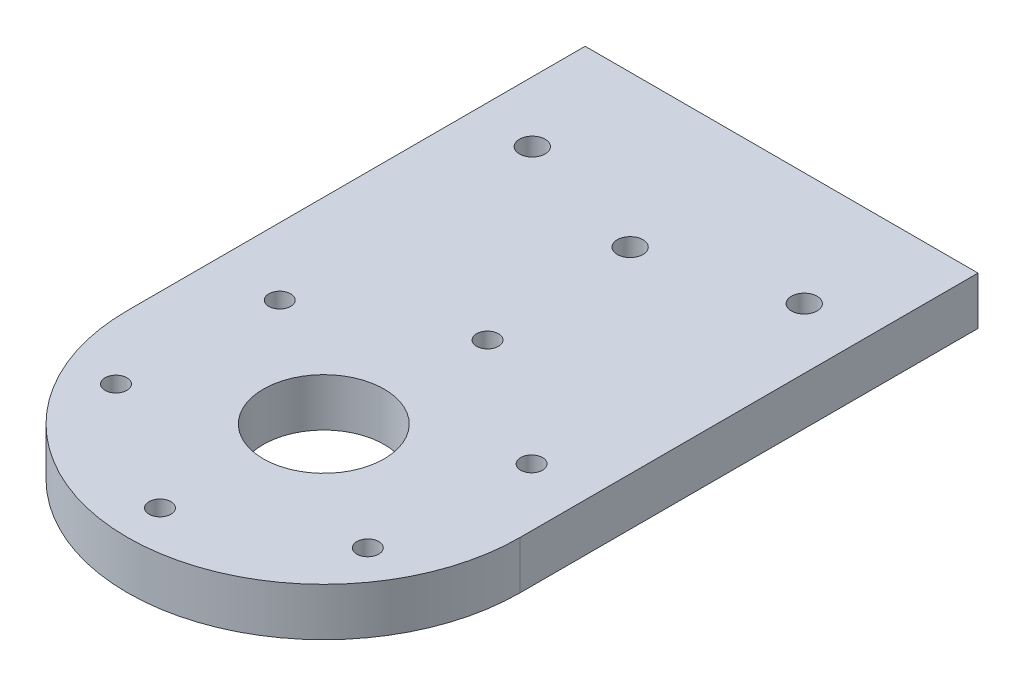
ISO-10303-21;
HEADER;
FILE_DESCRIPTION(('STEP AP214'),'2;1');
FILE_NAME('part.step','',(''),(''),'','','');
FILE_SCHEMA(('AUTOMOTIVE_DESIGN { 1 0 10303 214 1 1 1 1 }'));
ENDSEC;
DATA;
#1=APPLICATION_CONTEXT('core data for automotive mechanical design processes');
#2=APPLICATION_PROTOCOL_DEFINITION('international standard','automotive_design',2000,#1);
#3=PRODUCT_CONTEXT('',#1,'mechanical');
#4=PRODUCT('Part','Part','',(#3));
#5=PRODUCT_RELATED_PRODUCT_CATEGORY('part','',(#4));
#6=PRODUCT_DEFINITION_FORMATION('','',#4);
#7=PRODUCT_DEFINITION_CONTEXT('part definition',#1,'design');
#8=PRODUCT_DEFINITION('design','',#6,#7);
#9=PRODUCT_DEFINITION_SHAPE('','',#8);
#10=(LENGTH_UNIT() NAMED_UNIT(*) SI_UNIT(.MILLI.,.METRE.));
#11=(NAMED_UNIT(*) PLANE_ANGLE_UNIT() SI_UNIT($,.RADIAN.));
#12=(NAMED_UNIT(*) SI_UNIT($,.STERADIAN.) SOLID_ANGLE_UNIT());
#13=UNCERTAINTY_MEASURE_WITH_UNIT(LENGTH_MEASURE(1.E-05),#10,'distance_accuracy_value','');
#14=(GEOMETRIC_REPRESENTATION_CONTEXT(3) GLOBAL_UNCERTAINTY_ASSIGNED_CONTEXT((#13)) GLOBAL_UNIT_ASSIGNED_CONTEXT((#10,
#11,#12)) REPRESENTATION_CONTEXT('',''));
#15=CARTESIAN_POINT('',(0.,0.,0.));
#16=DIRECTION('',(0.,0.,1.));
#17=DIRECTION('',(1.,0.,0.));
#18=AXIS2_PLACEMENT_3D('',#15,#16,#17);
#19=CARTESIAN_POINT('',(126.4,56.875,275.95));
#20=DIRECTION('',(1.,0.,0.));
#21=DIRECTION('',(0.,0.,-1.));
#22=AXIS2_PLACEMENT_3D('',#19,#20,#21);
#23=PLANE('',#22);
#24=DIRECTION('',(0.,0.,1.));
#25=VECTOR('',#24,1.);
#26=CARTESIAN_POINT('',(126.4,50.525,275.95));
#27=LINE('',#26,#25);
#28=CARTESIAN_POINT('',(126.4,50.525,275.95));
#29=VERTEX_POINT('',#28);
#30=CARTESIAN_POINT('',(126.4,50.525,336.55));
#31=VERTEX_POINT('',#30);
#32=EDGE_CURVE('E94',#29,#31,#27,.T.);
#33=ORIENTED_EDGE('',*,*,#32,.T.);
#34=DIRECTION('',(0.,-1.,0.));
#35=VECTOR('',#34,1.);
#36=CARTESIAN_POINT('',(126.4,56.875,336.55));
#37=LINE('',#36,#35);
#38=CARTESIAN_POINT('',(126.4,56.875,336.55));
#39=VERTEX_POINT('',#38);
#40=EDGE_CURVE('E11',#39,#31,#37,.T.);
#41=ORIENTED_EDGE('',*,*,#40,.F.);
#42=DIRECTION('',(0.,0.,1.));
#43=VECTOR('',#42,1.);
#44=CARTESIAN_POINT('',(126.4,56.875,275.95));
#45=LINE('',#44,#43);
#46=CARTESIAN_POINT('',(126.4,56.875,275.95));
#47=VERTEX_POINT('',#46);
#48=EDGE_CURVE('E86',#47,#39,#45,.T.);
#49=ORIENTED_EDGE('',*,*,#48,.F.);
#50=DIRECTION('',(0.,-1.,0.));
#51=VECTOR('',#50,1.);
#52=CARTESIAN_POINT('',(126.4,56.875,275.95));
#53=LINE('',#52,#51);
#54=EDGE_CURVE('E83',#47,#29,#53,.T.);
#55=ORIENTED_EDGE('',*,*,#54,.T.);
#56=EDGE_LOOP('',(#33,#41,#49,#55));
#57=FACE_BOUND('',#56,.T.);
#58=ADVANCED_FACE('F43',(#57),#23,.F.);
#59=CARTESIAN_POINT('',(178.4,56.875,275.95));
#60=DIRECTION('',(-1.,0.,0.));
#61=DIRECTION('',(0.,0.,1.));
#62=AXIS2_PLACEMENT_3D('',#59,#60,#61);
#63=PLANE('',#62);
#64=DIRECTION('',(0.,0.,-1.));
#65=VECTOR('',#64,1.);
#66=CARTESIAN_POINT('',(178.4,50.525,275.95));
#67=LINE('',#66,#65);
#68=CARTESIAN_POINT('',(178.4,50.525,336.55));
#69=VERTEX_POINT('',#68);
#70=CARTESIAN_POINT('',(178.4,50.525,275.95));
#71=VERTEX_POINT('',#70);
#72=EDGE_CURVE('E75',#69,#71,#67,.T.);
#73=ORIENTED_EDGE('',*,*,#72,.T.);
#74=DIRECTION('',(0.,-1.,0.));
#75=VECTOR('',#74,1.);
#76=CARTESIAN_POINT('',(178.4,56.875,275.95));
#77=LINE('',#76,#75);
#78=CARTESIAN_POINT('',(178.4,56.875,275.95));
#79=VERTEX_POINT('',#78);
#80=EDGE_CURVE('E82',#79,#71,#77,.T.);
#81=ORIENTED_EDGE('',*,*,#80,.F.);
#82=DIRECTION('',(0.,0.,-1.));
#83=VECTOR('',#82,1.);
#84=CARTESIAN_POINT('',(178.4,56.875,275.95));
#85=LINE('',#84,#83);
#86=CARTESIAN_POINT('',(178.4,56.875,336.55));
#87=VERTEX_POINT('',#86);
#88=EDGE_CURVE('E108',#87,#79,#85,.T.);
#89=ORIENTED_EDGE('',*,*,#88,.F.);
#90=DIRECTION('',(0.,-1.,0.));
#91=VECTOR('',#90,1.);
#92=CARTESIAN_POINT('',(178.4,56.875,336.55));
#93=LINE('',#92,#91);
#94=EDGE_CURVE('E51',#87,#69,#93,.T.);
#95=ORIENTED_EDGE('',*,*,#94,.T.);
#96=EDGE_LOOP('',(#73,#81,#89,#95));
#97=FACE_BOUND('',#96,.T.);
#98=ADVANCED_FACE('F106',(#97),#63,.F.);
#99=CARTESIAN_POINT('',(126.4,56.875,275.95));
#100=DIRECTION('',(0.,0.,1.));
#101=DIRECTION('',(1.,0.,0.));
#102=AXIS2_PLACEMENT_3D('',#99,#100,#101);
#103=PLANE('',#102);
#104=CARTESIAN_POINT('',(130.4,53.7,275.95));
#105=DIRECTION('',(0.,0.,1.));
#106=DIRECTION('',(1.,0.,0.));
#107=AXIS2_PLACEMENT_3D('',#104,#105,#106);
#108=CIRCLE('',#107,2.);
#109=CARTESIAN_POINT('',(132.4,53.7,275.95));
#110=VERTEX_POINT('',#109);
#111=EDGE_CURVE('E169',#110,#110,#108,.T.);
#112=ORIENTED_EDGE('',*,*,#111,.T.);
#113=EDGE_LOOP('',(#112));
#114=FACE_BOUND('',#113,.T.);
#115=CARTESIAN_POINT('',(174.4,53.7,275.95));
#116=DIRECTION('',(0.,0.,1.));
#117=DIRECTION('',(1.,0.,0.));
#118=AXIS2_PLACEMENT_3D('',#115,#116,#117);
#119=CIRCLE('',#118,2.);
#120=CARTESIAN_POINT('',(176.4,53.7,275.95));
#121=VERTEX_POINT('',#120);
#122=EDGE_CURVE('E164',#121,#121,#119,.T.);
#123=ORIENTED_EDGE('',*,*,#122,.T.);
#124=EDGE_LOOP('',(#123));
#125=FACE_BOUND('',#124,.T.);
#126=DIRECTION('',(-1.,0.,0.));
#127=VECTOR('',#126,1.);
#128=CARTESIAN_POINT('',(126.4,50.525,275.95));
#129=LINE('',#128,#127);
#130=EDGE_CURVE('E76',#71,#29,#129,.T.);
#131=ORIENTED_EDGE('',*,*,#130,.T.);
#132=ORIENTED_EDGE('',*,*,#54,.F.);
#133=DIRECTION('',(-1.,0.,0.));
#134=VECTOR('',#133,1.);
#135=CARTESIAN_POINT('',(126.4,56.875,275.95));
#136=LINE('',#135,#134);
#137=EDGE_CURVE('E56',#79,#47,#136,.T.);
#138=ORIENTED_EDGE('',*,*,#137,.F.);
#139=ORIENTED_EDGE('',*,*,#80,.T.);
#140=EDGE_LOOP('',(#131,#132,#138,#139));
#141=FACE_BOUND('',#140,.T.);
#142=ADVANCED_FACE('F78',(#114,#125,#141),#103,.F.);
#143=CARTESIAN_POINT('',(0.,56.875,0.));
#144=DIRECTION('',(0.,1.,0.));
#145=DIRECTION('',(0.,0.,1.));
#146=AXIS2_PLACEMENT_3D('',#143,#144,#145);
#147=PLANE('',#146);
#148=CARTESIAN_POINT('',(152.4,56.875,296.));
#149=DIRECTION('',(0.,1.,0.));
#150=DIRECTION('',(0.,0.,1.));
#151=AXIS2_PLACEMENT_3D('',#148,#149,#150);
#152=CIRCLE('',#151,1.70000000000001);
#153=CARTESIAN_POINT('',(152.4,56.875,297.7));
#154=VERTEX_POINT('',#153);
#155=EDGE_CURVE('E178',#154,#154,#152,.T.);
#156=ORIENTED_EDGE('',*,*,#155,.F.);
#157=EDGE_LOOP('',(#156));
#158=FACE_BOUND('',#157,.T.);
#159=CARTESIAN_POINT('',(134.4,56.875,290.95));
#160=DIRECTION('',(0.,1.,0.));
#161=DIRECTION('',(0.,0.,1.));
#162=AXIS2_PLACEMENT_3D('',#159,#160,#161);
#163=CIRCLE('',#162,1.70000000000001);
#164=CARTESIAN_POINT('',(134.4,56.875,292.65));
#165=VERTEX_POINT('',#164);
#166=EDGE_CURVE('E168',#165,#165,#163,.T.);
#167=ORIENTED_EDGE('',*,*,#166,.F.);
#168=EDGE_LOOP('',(#167));
#169=FACE_BOUND('',#168,.T.);
#170=CARTESIAN_POINT('',(170.4,56.875,290.95));
#171=DIRECTION('',(0.,1.,0.));
#172=DIRECTION('',(0.,0.,1.));
#173=AXIS2_PLACEMENT_3D('',#170,#171,#172);
#174=CIRCLE('',#173,1.70000000000001);
#175=CARTESIAN_POINT('',(170.4,56.875,292.65));
#176=VERTEX_POINT('',#175);
#177=EDGE_CURVE('E172',#176,#176,#174,.T.);
#178=ORIENTED_EDGE('',*,*,#177,.F.);
#179=EDGE_LOOP('',(#178));
#180=FACE_BOUND('',#179,.T.);
#181=CARTESIAN_POINT('',(151.184219341693,56.875,357.013916472437));
#182=DIRECTION('',(0.,1.,0.));
#183=DIRECTION('',(0.,0.,1.));
#184=AXIS2_PLACEMENT_3D('',#181,#182,#183);
#185=CIRCLE('',#184,1.45000000000001);
#186=CARTESIAN_POINT('',(151.184219341693,56.875,358.463916472437));
#187=VERTEX_POINT('',#186);
#188=EDGE_CURVE('E143',#187,#187,#185,.T.);
#189=ORIENTED_EDGE('',*,*,#188,.F.);
#190=EDGE_LOOP('',(#189));
#191=FACE_BOUND('',#190,.T.);
#192=CARTESIAN_POINT('',(134.069838144793,56.875,345.729061300695));
#193=DIRECTION('',(0.,1.,0.));
#194=DIRECTION('',(0.,0.,1.));
#195=AXIS2_PLACEMENT_3D('',#192,#193,#194);
#196=CIRCLE('',#195,1.45000000000001);
#197=CARTESIAN_POINT('',(134.069838144793,56.875,347.179061300695));
#198=VERTEX_POINT('',#197);
#199=EDGE_CURVE('E138',#198,#198,#196,.T.);
#200=ORIENTED_EDGE('',*,*,#199,.F.);
#201=EDGE_LOOP('',(#200));
#202=FACE_BOUND('',#201,.T.);
#203=CARTESIAN_POINT('',(135.2856188031,56.875,325.265144828258));
#204=DIRECTION('',(0.,1.,0.));
#205=DIRECTION('',(0.,0.,1.));
#206=AXIS2_PLACEMENT_3D('',#203,#204,#205);
#207=CIRCLE('',#206,1.45000000000001);
#208=CARTESIAN_POINT('',(135.2856188031,56.875,326.715144828258));
#209=VERTEX_POINT('',#208);
#210=EDGE_CURVE('E133',#209,#209,#207,.T.);
#211=ORIENTED_EDGE('',*,*,#210,.F.);
#212=EDGE_LOOP('',(#211));
#213=FACE_BOUND('',#212,.T.);
#214=CARTESIAN_POINT('',(153.615780658307,56.875,316.086083527563));
#215=DIRECTION('',(0.,1.,0.));
#216=DIRECTION('',(0.,0.,1.));
#217=AXIS2_PLACEMENT_3D('',#214,#215,#216);
#218=CIRCLE('',#217,1.45000000000001);
#219=CARTESIAN_POINT('',(153.615780658307,56.875,317.536083527563));
#220=VERTEX_POINT('',#219);
#221=EDGE_CURVE('E128',#220,#220,#218,.T.);
#222=ORIENTED_EDGE('',*,*,#221,.F.);
#223=EDGE_LOOP('',(#222));
#224=FACE_BOUND('',#223,.T.);
#225=CARTESIAN_POINT('',(170.730161855207,56.875,327.370938699305));
#226=DIRECTION('',(0.,1.,0.));
#227=DIRECTION('',(0.,0.,1.));
#228=AXIS2_PLACEMENT_3D('',#225,#226,#227);
#229=CIRCLE('',#228,1.45000000000001);
#230=CARTESIAN_POINT('',(170.730161855207,56.875,328.820938699305));
#231=VERTEX_POINT('',#230);
#232=EDGE_CURVE('E156',#231,#231,#229,.T.);
#233=ORIENTED_EDGE('',*,*,#232,.F.);
#234=EDGE_LOOP('',(#233));
#235=FACE_BOUND('',#234,.T.);
#236=CARTESIAN_POINT('',(152.4,56.875,336.55));
#237=DIRECTION('',(0.,1.,0.));
#238=DIRECTION('',(0.,0.,1.));
#239=AXIS2_PLACEMENT_3D('',#236,#237,#238);
#240=CIRCLE('',#239,8.00000000000001);
#241=CARTESIAN_POINT('',(152.4,56.875,344.55));
#242=VERTEX_POINT('',#241);
#243=EDGE_CURVE('E146',#242,#242,#240,.T.);
#244=ORIENTED_EDGE('',*,*,#243,.F.);
#245=EDGE_LOOP('',(#244));
#246=FACE_BOUND('',#245,.T.);
#247=CARTESIAN_POINT('',(169.5143811969,56.875,347.834855171742));
#248=DIRECTION('',(0.,1.,0.));
#249=DIRECTION('',(0.,0.,1.));
#250=AXIS2_PLACEMENT_3D('',#247,#248,#249);
#251=CIRCLE('',#250,1.45000000000001);
#252=CARTESIAN_POINT('',(169.5143811969,56.875,349.284855171742));
#253=VERTEX_POINT('',#252);
#254=EDGE_CURVE('E117',#253,#253,#251,.T.);
#255=ORIENTED_EDGE('',*,*,#254,.F.);
#256=EDGE_LOOP('',(#255));
#257=FACE_BOUND('',#256,.T.);
#258=ORIENTED_EDGE('',*,*,#48,.T.);
#259=CARTESIAN_POINT('',(152.4,56.875,336.55));
#260=DIRECTION('',(0.,1.,0.));
#261=DIRECTION('',(0.,0.,1.));
#262=AXIS2_PLACEMENT_3D('',#259,#260,#261);
#263=CIRCLE('',#262,26.);
#264=EDGE_CURVE('E98',#39,#87,#263,.T.);
#265=ORIENTED_EDGE('',*,*,#264,.T.);
#266=ORIENTED_EDGE('',*,*,#88,.T.);
#267=ORIENTED_EDGE('',*,*,#137,.T.);
#268=EDGE_LOOP('',(#258,#265,#266,#267));
#269=FACE_BOUND('',#268,.T.);
#270=ADVANCED_FACE('F112',(#158,#169,#180,#191,#202,#213,#224,#235,#246,#257,#269),#147,.T.);
#271=CARTESIAN_POINT('',(0.,50.525,0.));
#272=DIRECTION('',(0.,1.,0.));
#273=DIRECTION('',(0.,0.,1.));
#274=AXIS2_PLACEMENT_3D('',#271,#272,#273);
#275=PLANE('',#274);
#276=CARTESIAN_POINT('',(152.4,50.525,296.));
#277=DIRECTION('',(0.,1.,0.));
#278=DIRECTION('',(0.,0.,1.));
#279=AXIS2_PLACEMENT_3D('',#276,#277,#278);
#280=CIRCLE('',#279,1.70000000000001);
#281=CARTESIAN_POINT('',(152.4,50.525,297.7));
#282=VERTEX_POINT('',#281);
#283=EDGE_CURVE('E187',#282,#282,#280,.T.);
#284=ORIENTED_EDGE('',*,*,#283,.T.);
#285=EDGE_LOOP('',(#284));
#286=FACE_BOUND('',#285,.T.);
#287=CARTESIAN_POINT('',(134.4,50.525,290.95));
#288=DIRECTION('',(0.,1.,0.));
#289=DIRECTION('',(0.,0.,1.));
#290=AXIS2_PLACEMENT_3D('',#287,#288,#289);
#291=CIRCLE('',#290,1.70000000000001);
#292=CARTESIAN_POINT('',(134.4,50.525,292.65));
#293=VERTEX_POINT('',#292);
#294=EDGE_CURVE('E181',#293,#293,#291,.T.);
#295=ORIENTED_EDGE('',*,*,#294,.T.);
#296=EDGE_LOOP('',(#295));
#297=FACE_BOUND('',#296,.T.);
#298=CARTESIAN_POINT('',(170.4,50.525,290.95));
#299=DIRECTION('',(0.,1.,0.));
#300=DIRECTION('',(0.,0.,1.));
#301=AXIS2_PLACEMENT_3D('',#298,#299,#300);
#302=CIRCLE('',#301,1.70000000000001);
#303=CARTESIAN_POINT('',(170.4,50.525,292.65));
#304=VERTEX_POINT('',#303);
#305=EDGE_CURVE('E180',#304,#304,#302,.T.);
#306=ORIENTED_EDGE('',*,*,#305,.T.);
#307=EDGE_LOOP('',(#306));
#308=FACE_BOUND('',#307,.T.);
#309=CARTESIAN_POINT('',(151.184219341693,50.525,357.013916472437));
#310=DIRECTION('',(0.,1.,0.));
#311=DIRECTION('',(0.,0.,1.));
#312=AXIS2_PLACEMENT_3D('',#309,#310,#311);
#313=CIRCLE('',#312,1.45000000000001);
#314=CARTESIAN_POINT('',(151.184219341693,50.525,358.463916472437));
#315=VERTEX_POINT('',#314);
#316=EDGE_CURVE('E124',#315,#315,#313,.T.);
#317=ORIENTED_EDGE('',*,*,#316,.T.);
#318=EDGE_LOOP('',(#317));
#319=FACE_BOUND('',#318,.T.);
#320=CARTESIAN_POINT('',(134.069838144793,50.525,345.729061300695));
#321=DIRECTION('',(0.,1.,0.));
#322=DIRECTION('',(0.,0.,1.));
#323=AXIS2_PLACEMENT_3D('',#320,#321,#322);
#324=CIRCLE('',#323,1.45000000000001);
#325=CARTESIAN_POINT('',(134.069838144793,50.525,347.179061300695));
#326=VERTEX_POINT('',#325);
#327=EDGE_CURVE('E145',#326,#326,#324,.T.);
#328=ORIENTED_EDGE('',*,*,#327,.T.);
#329=EDGE_LOOP('',(#328));
#330=FACE_BOUND('',#329,.T.);
#331=CARTESIAN_POINT('',(135.2856188031,50.525,325.265144828258));
#332=DIRECTION('',(0.,1.,0.));
#333=DIRECTION('',(0.,0.,1.));
#334=AXIS2_PLACEMENT_3D('',#331,#332,#333);
#335=CIRCLE('',#334,1.45000000000001);
#336=CARTESIAN_POINT('',(135.2856188031,50.525,326.715144828258));
#337=VERTEX_POINT('',#336);
#338=EDGE_CURVE('E139',#337,#337,#335,.T.);
#339=ORIENTED_EDGE('',*,*,#338,.T.);
#340=EDGE_LOOP('',(#339));
#341=FACE_BOUND('',#340,.T.);
#342=CARTESIAN_POINT('',(153.615780658307,50.525,316.086083527563));
#343=DIRECTION('',(0.,1.,0.));
#344=DIRECTION('',(0.,0.,1.));
#345=AXIS2_PLACEMENT_3D('',#342,#343,#344);
#346=CIRCLE('',#345,1.45000000000001);
#347=CARTESIAN_POINT('',(153.615780658307,50.525,317.536083527563));
#348=VERTEX_POINT('',#347);
#349=EDGE_CURVE('E130',#348,#348,#346,.T.);
#350=ORIENTED_EDGE('',*,*,#349,.T.);
#351=EDGE_LOOP('',(#350));
#352=FACE_BOUND('',#351,.T.);
#353=CARTESIAN_POINT('',(170.730161855207,50.525,327.370938699305));
#354=DIRECTION('',(0.,1.,0.));
#355=DIRECTION('',(0.,0.,1.));
#356=AXIS2_PLACEMENT_3D('',#353,#354,#355);
#357=CIRCLE('',#356,1.45000000000001);
#358=CARTESIAN_POINT('',(170.730161855207,50.525,328.820938699305));
#359=VERTEX_POINT('',#358);
#360=EDGE_CURVE('E126',#359,#359,#357,.T.);
#361=ORIENTED_EDGE('',*,*,#360,.T.);
#362=EDGE_LOOP('',(#361));
#363=FACE_BOUND('',#362,.T.);
#364=CARTESIAN_POINT('',(152.4,50.525,336.55));
#365=DIRECTION('',(0.,1.,0.));
#366=DIRECTION('',(0.,0.,1.));
#367=AXIS2_PLACEMENT_3D('',#364,#365,#366);
#368=CIRCLE('',#367,8.00000000000001);
#369=CARTESIAN_POINT('',(152.4,50.525,344.55));
#370=VERTEX_POINT('',#369);
#371=EDGE_CURVE('E153',#370,#370,#368,.T.);
#372=ORIENTED_EDGE('',*,*,#371,.T.);
#373=EDGE_LOOP('',(#372));
#374=FACE_BOUND('',#373,.T.);
#375=CARTESIAN_POINT('',(169.5143811969,50.525,347.834855171742));
#376=DIRECTION('',(0.,1.,0.));
#377=DIRECTION('',(0.,0.,1.));
#378=AXIS2_PLACEMENT_3D('',#375,#376,#377);
#379=CIRCLE('',#378,1.45000000000001);
#380=CARTESIAN_POINT('',(169.5143811969,50.525,349.284855171742));
#381=VERTEX_POINT('',#380);
#382=EDGE_CURVE('E119',#381,#381,#379,.T.);
#383=ORIENTED_EDGE('',*,*,#382,.T.);
#384=EDGE_LOOP('',(#383));
#385=FACE_BOUND('',#384,.T.);
#386=ORIENTED_EDGE('',*,*,#72,.F.);
#387=CARTESIAN_POINT('',(152.4,50.525,336.55));
#388=DIRECTION('',(0.,1.,0.));
#389=DIRECTION('',(0.,0.,1.));
#390=AXIS2_PLACEMENT_3D('',#387,#388,#389);
#391=CIRCLE('',#390,26.);
#392=EDGE_CURVE('E92',#31,#69,#391,.T.);
#393=ORIENTED_EDGE('',*,*,#392,.F.);
#394=ORIENTED_EDGE('',*,*,#32,.F.);
#395=ORIENTED_EDGE('',*,*,#130,.F.);
#396=EDGE_LOOP('',(#386,#393,#394,#395));
#397=FACE_BOUND('',#396,.T.);
#398=ADVANCED_FACE('F93',(#286,#297,#308,#319,#330,#341,#352,#363,#374,#385,#397),#275,.F.);
#399=CARTESIAN_POINT('',(152.4,56.875,336.55));
#400=DIRECTION('',(0.,-1.,0.));
#401=DIRECTION('',(0.,0.,-1.));
#402=AXIS2_PLACEMENT_3D('',#399,#400,#401);
#403=CYLINDRICAL_SURFACE('',#402,26.);
#404=ORIENTED_EDGE('',*,*,#264,.F.);
#405=ORIENTED_EDGE('',*,*,#40,.T.);
#406=ORIENTED_EDGE('',*,*,#392,.T.);
#407=ORIENTED_EDGE('',*,*,#94,.F.);
#408=EDGE_LOOP('',(#404,#405,#406,#407));
#409=FACE_BOUND('',#408,.T.);
#410=ADVANCED_FACE('F111',(#409),#403,.T.);
#411=CARTESIAN_POINT('',(169.5143811969,56.875,347.834855171742));
#412=DIRECTION('',(0.,-1.,0.));
#413=DIRECTION('',(0.,0.,-1.));
#414=AXIS2_PLACEMENT_3D('',#411,#412,#413);
#415=CYLINDRICAL_SURFACE('',#414,1.45000000000001);
#416=ORIENTED_EDGE('',*,*,#254,.T.);
#417=EDGE_LOOP('',(#416));
#418=FACE_BOUND('',#417,.T.);
#419=ORIENTED_EDGE('',*,*,#382,.F.);
#420=EDGE_LOOP('',(#419));
#421=FACE_BOUND('',#420,.T.);
#422=ADVANCED_FACE('F216',(#418,#421),#415,.F.);
#423=CARTESIAN_POINT('',(152.4,56.875,336.55));
#424=DIRECTION('',(0.,-1.,0.));
#425=DIRECTION('',(0.,0.,-1.));
#426=AXIS2_PLACEMENT_3D('',#423,#424,#425);
#427=CYLINDRICAL_SURFACE('',#426,8.00000000000001);
#428=ORIENTED_EDGE('',*,*,#243,.T.);
#429=EDGE_LOOP('',(#428));
#430=FACE_BOUND('',#429,.T.);
#431=ORIENTED_EDGE('',*,*,#371,.F.);
#432=EDGE_LOOP('',(#431));
#433=FACE_BOUND('',#432,.T.);
#434=ADVANCED_FACE('F217',(#430,#433),#427,.F.);
#435=CARTESIAN_POINT('',(170.730161855207,56.875,327.370938699305));
#436=DIRECTION('',(0.,-1.,0.));
#437=DIRECTION('',(0.,0.,-1.));
#438=AXIS2_PLACEMENT_3D('',#435,#436,#437);
#439=CYLINDRICAL_SURFACE('',#438,1.45000000000001);
#440=ORIENTED_EDGE('',*,*,#232,.T.);
#441=EDGE_LOOP('',(#440));
#442=FACE_BOUND('',#441,.T.);
#443=ORIENTED_EDGE('',*,*,#360,.F.);
#444=EDGE_LOOP('',(#443));
#445=FACE_BOUND('',#444,.T.);
#446=ADVANCED_FACE('F269',(#442,#445),#439,.F.);
#447=CARTESIAN_POINT('',(153.615780658307,56.875,316.086083527563));
#448=DIRECTION('',(0.,-1.,0.));
#449=DIRECTION('',(0.,0.,-1.));
#450=AXIS2_PLACEMENT_3D('',#447,#448,#449);
#451=CYLINDRICAL_SURFACE('',#450,1.45000000000001);
#452=ORIENTED_EDGE('',*,*,#221,.T.);
#453=EDGE_LOOP('',(#452));
#454=FACE_BOUND('',#453,.T.);
#455=ORIENTED_EDGE('',*,*,#349,.F.);
#456=EDGE_LOOP('',(#455));
#457=FACE_BOUND('',#456,.T.);
#458=ADVANCED_FACE('F268',(#454,#457),#451,.F.);
#459=CARTESIAN_POINT('',(135.2856188031,56.875,325.265144828258));
#460=DIRECTION('',(0.,-1.,0.));
#461=DIRECTION('',(0.,0.,-1.));
#462=AXIS2_PLACEMENT_3D('',#459,#460,#461);
#463=CYLINDRICAL_SURFACE('',#462,1.45000000000001);
#464=ORIENTED_EDGE('',*,*,#210,.T.);
#465=EDGE_LOOP('',(#464));
#466=FACE_BOUND('',#465,.T.);
#467=ORIENTED_EDGE('',*,*,#338,.F.);
#468=EDGE_LOOP('',(#467));
#469=FACE_BOUND('',#468,.T.);
#470=ADVANCED_FACE('F278',(#466,#469),#463,.F.);
#471=CARTESIAN_POINT('',(134.069838144793,56.875,345.729061300695));
#472=DIRECTION('',(0.,-1.,0.));
#473=DIRECTION('',(0.,0.,-1.));
#474=AXIS2_PLACEMENT_3D('',#471,#472,#473);
#475=CYLINDRICAL_SURFACE('',#474,1.45000000000001);
#476=ORIENTED_EDGE('',*,*,#199,.T.);
#477=EDGE_LOOP('',(#476));
#478=FACE_BOUND('',#477,.T.);
#479=ORIENTED_EDGE('',*,*,#327,.F.);
#480=EDGE_LOOP('',(#479));
#481=FACE_BOUND('',#480,.T.);
#482=ADVANCED_FACE('F256',(#478,#481),#475,.F.);
#483=CARTESIAN_POINT('',(151.184219341693,56.875,357.013916472437));
#484=DIRECTION('',(0.,-1.,0.));
#485=DIRECTION('',(0.,0.,-1.));
#486=AXIS2_PLACEMENT_3D('',#483,#484,#485);
#487=CYLINDRICAL_SURFACE('',#486,1.45000000000001);
#488=ORIENTED_EDGE('',*,*,#188,.T.);
#489=EDGE_LOOP('',(#488));
#490=FACE_BOUND('',#489,.T.);
#491=ORIENTED_EDGE('',*,*,#316,.F.);
#492=EDGE_LOOP('',(#491));
#493=FACE_BOUND('',#492,.T.);
#494=ADVANCED_FACE('F252',(#490,#493),#487,.F.);
#495=CARTESIAN_POINT('',(174.4,53.7,283.95));
#496=DIRECTION('',(0.,0.,-1.));
#497=DIRECTION('',(-1.,0.,0.));
#498=AXIS2_PLACEMENT_3D('',#495,#496,#497);
#499=CYLINDRICAL_SURFACE('',#498,2.);
#500=CARTESIAN_POINT('',(174.4,53.7,283.95));
#501=DIRECTION('',(0.,0.,1.));
#502=DIRECTION('',(1.,0.,0.));
#503=AXIS2_PLACEMENT_3D('',#500,#501,#502);
#504=CIRCLE('',#503,2.);
#505=CARTESIAN_POINT('',(176.4,53.7,283.95));
#506=VERTEX_POINT('',#505);
#507=EDGE_CURVE('E162',#506,#506,#504,.T.);
#508=ORIENTED_EDGE('',*,*,#507,.T.);
#509=EDGE_LOOP('',(#508));
#510=FACE_BOUND('',#509,.T.);
#511=ORIENTED_EDGE('',*,*,#122,.F.);
#512=EDGE_LOOP('',(#511));
#513=FACE_BOUND('',#512,.T.);
#514=ADVANCED_FACE('F248',(#510,#513),#499,.F.);
#515=CARTESIAN_POINT('',(174.4,53.7,283.95));
#516=DIRECTION('',(0.,0.,1.));
#517=DIRECTION('',(1.,0.,0.));
#518=AXIS2_PLACEMENT_3D('',#515,#516,#517);
#519=PLANE('',#518);
#520=ORIENTED_EDGE('',*,*,#507,.F.);
#521=EDGE_LOOP('',(#520));
#522=FACE_BOUND('',#521,.T.);
#523=ADVANCED_FACE('F249',(#522),#519,.F.);
#524=CARTESIAN_POINT('',(130.4,53.7,283.95));
#525=DIRECTION('',(0.,0.,-1.));
#526=DIRECTION('',(-1.,0.,0.));
#527=AXIS2_PLACEMENT_3D('',#524,#525,#526);
#528=CYLINDRICAL_SURFACE('',#527,2.);
#529=CARTESIAN_POINT('',(130.4,53.7,283.95));
#530=DIRECTION('',(0.,0.,1.));
#531=DIRECTION('',(1.,0.,0.));
#532=AXIS2_PLACEMENT_3D('',#529,#530,#531);
#533=CIRCLE('',#532,2.);
#534=CARTESIAN_POINT('',(132.4,53.7,283.95));
#535=VERTEX_POINT('',#534);
#536=EDGE_CURVE('E152',#535,#535,#533,.T.);
#537=ORIENTED_EDGE('',*,*,#536,.T.);
#538=EDGE_LOOP('',(#537));
#539=FACE_BOUND('',#538,.T.);
#540=ORIENTED_EDGE('',*,*,#111,.F.);
#541=EDGE_LOOP('',(#540));
#542=FACE_BOUND('',#541,.T.);
#543=ADVANCED_FACE('F259',(#539,#542),#528,.F.);
#544=CARTESIAN_POINT('',(130.4,53.7,283.95));
#545=DIRECTION('',(0.,0.,1.));
#546=DIRECTION('',(1.,0.,0.));
#547=AXIS2_PLACEMENT_3D('',#544,#545,#546);
#548=PLANE('',#547);
#549=ORIENTED_EDGE('',*,*,#536,.F.);
#550=EDGE_LOOP('',(#549));
#551=FACE_BOUND('',#550,.T.);
#552=ADVANCED_FACE('F334',(#551),#548,.F.);
#553=CARTESIAN_POINT('',(170.4,56.875,290.95));
#554=DIRECTION('',(0.,-1.,0.));
#555=DIRECTION('',(0.,0.,-1.));
#556=AXIS2_PLACEMENT_3D('',#553,#554,#555);
#557=CYLINDRICAL_SURFACE('',#556,1.70000000000001);
#558=ORIENTED_EDGE('',*,*,#177,.T.);
#559=EDGE_LOOP('',(#558));
#560=FACE_BOUND('',#559,.T.);
#561=ORIENTED_EDGE('',*,*,#305,.F.);
#562=EDGE_LOOP('',(#561));
#563=FACE_BOUND('',#562,.T.);
#564=ADVANCED_FACE('F338',(#560,#563),#557,.F.);
#565=CARTESIAN_POINT('',(134.4,56.875,290.95));
#566=DIRECTION('',(0.,-1.,0.));
#567=DIRECTION('',(0.,0.,-1.));
#568=AXIS2_PLACEMENT_3D('',#565,#566,#567);
#569=CYLINDRICAL_SURFACE('',#568,1.70000000000001);
#570=ORIENTED_EDGE('',*,*,#166,.T.);
#571=EDGE_LOOP('',(#570));
#572=FACE_BOUND('',#571,.T.);
#573=ORIENTED_EDGE('',*,*,#294,.F.);
#574=EDGE_LOOP('',(#573));
#575=FACE_BOUND('',#574,.T.);
#576=ADVANCED_FACE('F347',(#572,#575),#569,.F.);
#577=CARTESIAN_POINT('',(152.4,56.875,296.));
#578=DIRECTION('',(0.,-1.,0.));
#579=DIRECTION('',(0.,0.,-1.));
#580=AXIS2_PLACEMENT_3D('',#577,#578,#579);
#581=CYLINDRICAL_SURFACE('',#580,1.70000000000001);
#582=ORIENTED_EDGE('',*,*,#155,.T.);
#583=EDGE_LOOP('',(#582));
#584=FACE_BOUND('',#583,.T.);
#585=ORIENTED_EDGE('',*,*,#283,.F.);
#586=EDGE_LOOP('',(#585));
#587=FACE_BOUND('',#586,.T.);
#588=ADVANCED_FACE('F194',(#584,#587),#581,.F.);
#589=CLOSED_SHELL('',(#58,#98,#142,#270,#398,#410,#422,#434,#446,#458,#470,#482,#494,#514,#523,
#543,#552,#564,#576,#588));
#590=MANIFOLD_SOLID_BREP('B2',#589);
#591=ADVANCED_BREP_SHAPE_REPRESENTATION('',(#18,#590),#14);
#592=SHAPE_DEFINITION_REPRESENTATION(#9,#591);
ENDSEC;
END-ISO-10303-21;
